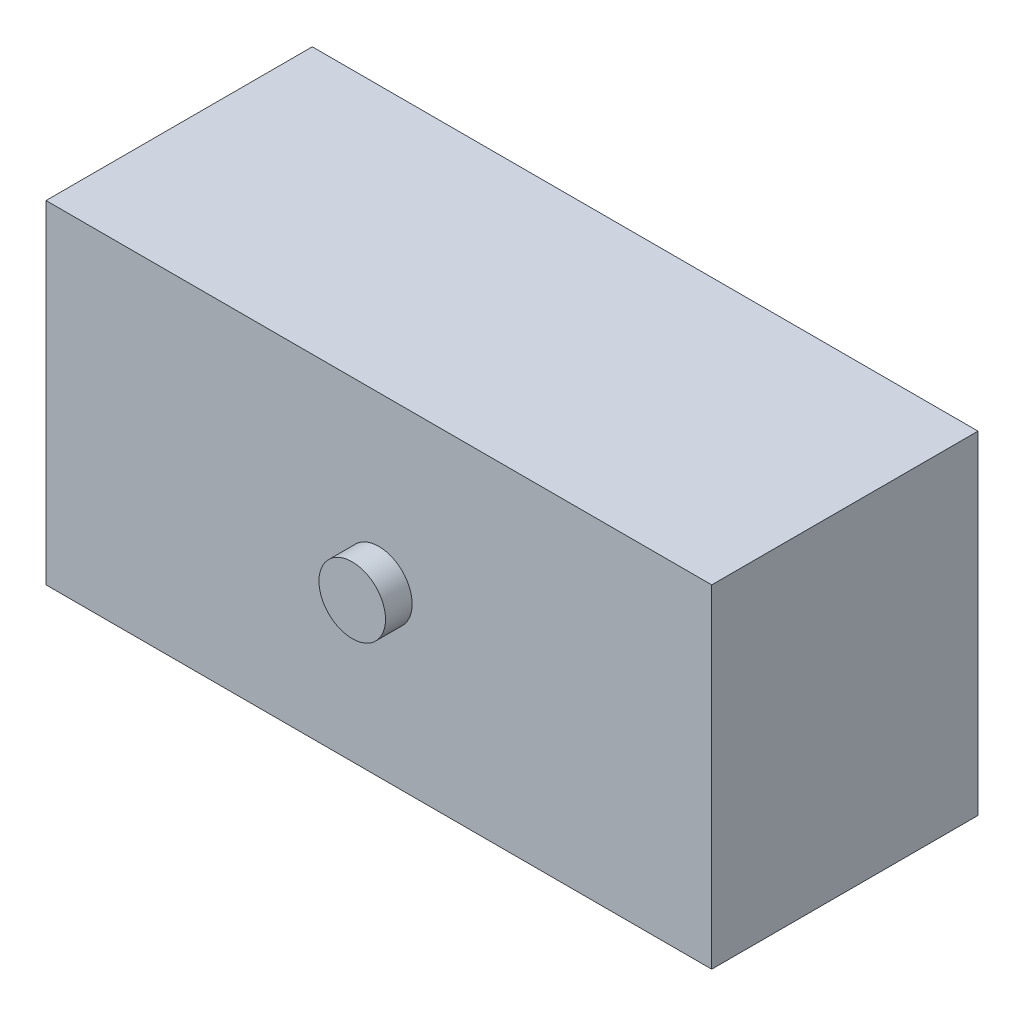
ISO-10303-21;
HEADER;
FILE_DESCRIPTION(('STEP AP214'),'2;1');
FILE_NAME('part.step','',(''),(''),'','','');
FILE_SCHEMA(('AUTOMOTIVE_DESIGN { 1 0 10303 214 1 1 1 1 }'));
ENDSEC;
DATA;
#1=APPLICATION_CONTEXT('core data for automotive mechanical design processes');
#2=APPLICATION_PROTOCOL_DEFINITION('international standard','automotive_design',2000,#1);
#3=PRODUCT_CONTEXT('',#1,'mechanical');
#4=PRODUCT('Part','Part','',(#3));
#5=PRODUCT_RELATED_PRODUCT_CATEGORY('part','',(#4));
#6=PRODUCT_DEFINITION_FORMATION('','',#4);
#7=PRODUCT_DEFINITION_CONTEXT('part definition',#1,'design');
#8=PRODUCT_DEFINITION('design','',#6,#7);
#9=PRODUCT_DEFINITION_SHAPE('','',#8);
#10=(LENGTH_UNIT() NAMED_UNIT(*) SI_UNIT(.MILLI.,.METRE.));
#11=(NAMED_UNIT(*) PLANE_ANGLE_UNIT() SI_UNIT($,.RADIAN.));
#12=(NAMED_UNIT(*) SI_UNIT($,.STERADIAN.) SOLID_ANGLE_UNIT());
#13=UNCERTAINTY_MEASURE_WITH_UNIT(LENGTH_MEASURE(1.E-05),#10,'distance_accuracy_value','');
#14=(GEOMETRIC_REPRESENTATION_CONTEXT(3) GLOBAL_UNCERTAINTY_ASSIGNED_CONTEXT((#13)) GLOBAL_UNIT_ASSIGNED_CONTEXT((#10,
#11,#12)) REPRESENTATION_CONTEXT('',''));
#15=CARTESIAN_POINT('',(0.,0.,0.));
#16=DIRECTION('',(0.,0.,1.));
#17=DIRECTION('',(1.,0.,0.));
#18=AXIS2_PLACEMENT_3D('',#15,#16,#17);
#19=CARTESIAN_POINT('',(25.,-12.5,-20.));
#20=DIRECTION('',(1.,0.,0.));
#21=DIRECTION('',(0.,0.,-1.));
#22=AXIS2_PLACEMENT_3D('',#19,#20,#21);
#23=PLANE('',#22);
#24=DIRECTION('',(0.,1.,0.));
#25=VECTOR('',#24,1.);
#26=CARTESIAN_POINT('',(25.,-12.5,0.));
#27=LINE('',#26,#25);
#28=CARTESIAN_POINT('',(25.,-12.5,0.));
#29=VERTEX_POINT('',#28);
#30=CARTESIAN_POINT('',(25.,12.5,0.));
#31=VERTEX_POINT('',#30);
#32=EDGE_CURVE('E93',#29,#31,#27,.T.);
#33=ORIENTED_EDGE('',*,*,#32,.F.);
#34=DIRECTION('',(0.,0.,1.));
#35=VECTOR('',#34,1.);
#36=CARTESIAN_POINT('',(25.,-12.5,-20.));
#37=LINE('',#36,#35);
#38=CARTESIAN_POINT('',(25.,-12.5,-20.));
#39=VERTEX_POINT('',#38);
#40=EDGE_CURVE('E28',#39,#29,#37,.T.);
#41=ORIENTED_EDGE('',*,*,#40,.F.);
#42=DIRECTION('',(0.,1.,0.));
#43=VECTOR('',#42,1.);
#44=CARTESIAN_POINT('',(25.,-12.5,-20.));
#45=LINE('',#44,#43);
#46=CARTESIAN_POINT('',(25.,12.5,-20.));
#47=VERTEX_POINT('',#46);
#48=EDGE_CURVE('E83',#39,#47,#45,.T.);
#49=ORIENTED_EDGE('',*,*,#48,.T.);
#50=DIRECTION('',(0.,0.,1.));
#51=VECTOR('',#50,1.);
#52=CARTESIAN_POINT('',(25.,12.5,-20.));
#53=LINE('',#52,#51);
#54=EDGE_CURVE('E63',#47,#31,#53,.T.);
#55=ORIENTED_EDGE('',*,*,#54,.T.);
#56=EDGE_LOOP('',(#33,#41,#49,#55));
#57=FACE_BOUND('',#56,.T.);
#58=ADVANCED_FACE('F19',(#57),#23,.T.);
#59=CARTESIAN_POINT('',(-25.,-12.5,-20.));
#60=DIRECTION('',(0.,-1.,0.));
#61=DIRECTION('',(0.,0.,-1.));
#62=AXIS2_PLACEMENT_3D('',#59,#60,#61);
#63=PLANE('',#62);
#64=DIRECTION('',(1.,0.,0.));
#65=VECTOR('',#64,1.);
#66=CARTESIAN_POINT('',(-25.,-12.5,0.));
#67=LINE('',#66,#65);
#68=CARTESIAN_POINT('',(-25.,-12.5,0.));
#69=VERTEX_POINT('',#68);
#70=EDGE_CURVE('E87',#69,#29,#67,.T.);
#71=ORIENTED_EDGE('',*,*,#70,.F.);
#72=DIRECTION('',(0.,0.,1.));
#73=VECTOR('',#72,1.);
#74=CARTESIAN_POINT('',(-25.,-12.5,-20.));
#75=LINE('',#74,#73);
#76=CARTESIAN_POINT('',(-25.,-12.5,-20.));
#77=VERTEX_POINT('',#76);
#78=EDGE_CURVE('E52',#77,#69,#75,.T.);
#79=ORIENTED_EDGE('',*,*,#78,.F.);
#80=DIRECTION('',(1.,0.,0.));
#81=VECTOR('',#80,1.);
#82=CARTESIAN_POINT('',(-25.,-12.5,-20.));
#83=LINE('',#82,#81);
#84=EDGE_CURVE('E78',#77,#39,#83,.T.);
#85=ORIENTED_EDGE('',*,*,#84,.T.);
#86=ORIENTED_EDGE('',*,*,#40,.T.);
#87=EDGE_LOOP('',(#71,#79,#85,#86));
#88=FACE_BOUND('',#87,.T.);
#89=ADVANCED_FACE('F119',(#88),#63,.T.);
#90=CARTESIAN_POINT('',(-25.,-12.5,-20.));
#91=DIRECTION('',(-1.,0.,0.));
#92=DIRECTION('',(0.,0.,1.));
#93=AXIS2_PLACEMENT_3D('',#90,#91,#92);
#94=PLANE('',#93);
#95=DIRECTION('',(0.,-1.,0.));
#96=VECTOR('',#95,1.);
#97=CARTESIAN_POINT('',(-25.,-12.5,0.));
#98=LINE('',#97,#96);
#99=CARTESIAN_POINT('',(-25.,12.5,0.));
#100=VERTEX_POINT('',#99);
#101=EDGE_CURVE('E71',#100,#69,#98,.T.);
#102=ORIENTED_EDGE('',*,*,#101,.F.);
#103=DIRECTION('',(0.,0.,1.));
#104=VECTOR('',#103,1.);
#105=CARTESIAN_POINT('',(-25.,12.5,-20.));
#106=LINE('',#105,#104);
#107=CARTESIAN_POINT('',(-25.,12.5,-20.));
#108=VERTEX_POINT('',#107);
#109=EDGE_CURVE('E66',#108,#100,#106,.T.);
#110=ORIENTED_EDGE('',*,*,#109,.F.);
#111=DIRECTION('',(0.,-1.,0.));
#112=VECTOR('',#111,1.);
#113=CARTESIAN_POINT('',(-25.,-12.5,-20.));
#114=LINE('',#113,#112);
#115=EDGE_CURVE('E69',#108,#77,#114,.T.);
#116=ORIENTED_EDGE('',*,*,#115,.T.);
#117=ORIENTED_EDGE('',*,*,#78,.T.);
#118=EDGE_LOOP('',(#102,#110,#116,#117));
#119=FACE_BOUND('',#118,.T.);
#120=ADVANCED_FACE('F68',(#119),#94,.T.);
#121=CARTESIAN_POINT('',(-25.,12.5,-20.));
#122=DIRECTION('',(0.,1.,0.));
#123=DIRECTION('',(0.,0.,1.));
#124=AXIS2_PLACEMENT_3D('',#121,#122,#123);
#125=PLANE('',#124);
#126=DIRECTION('',(-1.,0.,0.));
#127=VECTOR('',#126,1.);
#128=CARTESIAN_POINT('',(-25.,12.5,0.));
#129=LINE('',#128,#127);
#130=EDGE_CURVE('E98',#31,#100,#129,.T.);
#131=ORIENTED_EDGE('',*,*,#130,.F.);
#132=ORIENTED_EDGE('',*,*,#54,.F.);
#133=DIRECTION('',(-1.,0.,0.));
#134=VECTOR('',#133,1.);
#135=CARTESIAN_POINT('',(-25.,12.5,-20.));
#136=LINE('',#135,#134);
#137=EDGE_CURVE('E77',#47,#108,#136,.T.);
#138=ORIENTED_EDGE('',*,*,#137,.T.);
#139=ORIENTED_EDGE('',*,*,#109,.T.);
#140=EDGE_LOOP('',(#131,#132,#138,#139));
#141=FACE_BOUND('',#140,.T.);
#142=ADVANCED_FACE('F81',(#141),#125,.T.);
#143=CARTESIAN_POINT('',(0.,0.,-20.));
#144=DIRECTION('',(0.,0.,-1.));
#145=DIRECTION('',(-1.,0.,0.));
#146=AXIS2_PLACEMENT_3D('',#143,#144,#145);
#147=PLANE('',#146);
#148=ORIENTED_EDGE('',*,*,#48,.F.);
#149=ORIENTED_EDGE('',*,*,#84,.F.);
#150=ORIENTED_EDGE('',*,*,#115,.F.);
#151=ORIENTED_EDGE('',*,*,#137,.F.);
#152=EDGE_LOOP('',(#148,#149,#150,#151));
#153=FACE_BOUND('',#152,.T.);
#154=ADVANCED_FACE('F76',(#153),#147,.T.);
#155=CARTESIAN_POINT('',(0.,0.,0.));
#156=DIRECTION('',(0.,0.,-1.));
#157=DIRECTION('',(-1.,0.,0.));
#158=AXIS2_PLACEMENT_3D('',#155,#156,#157);
#159=PLANE('',#158);
#160=CARTESIAN_POINT('',(0.,0.,0.));
#161=DIRECTION('',(0.,0.,-1.));
#162=DIRECTION('',(-1.,0.,0.));
#163=AXIS2_PLACEMENT_3D('',#160,#161,#162);
#164=CIRCLE('',#163,2.5);
#165=CARTESIAN_POINT('',(-2.5,0.,0.));
#166=VERTEX_POINT('',#165);
#167=EDGE_CURVE('E11',#166,#166,#164,.F.);
#168=ORIENTED_EDGE('',*,*,#167,.F.);
#169=EDGE_LOOP('',(#168));
#170=FACE_BOUND('',#169,.T.);
#171=ORIENTED_EDGE('',*,*,#32,.T.);
#172=ORIENTED_EDGE('',*,*,#130,.T.);
#173=ORIENTED_EDGE('',*,*,#101,.T.);
#174=ORIENTED_EDGE('',*,*,#70,.T.);
#175=EDGE_LOOP('',(#171,#172,#173,#174));
#176=FACE_BOUND('',#175,.T.);
#177=ADVANCED_FACE('F118',(#170,#176),#159,.F.);
#178=CARTESIAN_POINT('',(0.,0.,2.));
#179=DIRECTION('',(0.,0.,-1.));
#180=DIRECTION('',(-1.,0.,0.));
#181=AXIS2_PLACEMENT_3D('',#178,#179,#180);
#182=CYLINDRICAL_SURFACE('',#181,2.5);
#183=CARTESIAN_POINT('',(0.,0.,2.));
#184=DIRECTION('',(0.,0.,1.));
#185=DIRECTION('',(1.,0.,0.));
#186=AXIS2_PLACEMENT_3D('',#183,#184,#185);
#187=CIRCLE('',#186,2.5);
#188=CARTESIAN_POINT('',(2.5,0.,2.));
#189=VERTEX_POINT('',#188);
#190=EDGE_CURVE('E99',#189,#189,#187,.T.);
#191=ORIENTED_EDGE('',*,*,#190,.F.);
#192=EDGE_LOOP('',(#191));
#193=FACE_BOUND('',#192,.T.);
#194=ORIENTED_EDGE('',*,*,#167,.T.);
#195=EDGE_LOOP('',(#194));
#196=FACE_BOUND('',#195,.T.);
#197=ADVANCED_FACE('F134',(#193,#196),#182,.T.);
#198=CARTESIAN_POINT('',(0.,0.,2.));
#199=DIRECTION('',(0.,0.,1.));
#200=DIRECTION('',(1.,0.,0.));
#201=AXIS2_PLACEMENT_3D('',#198,#199,#200);
#202=PLANE('',#201);
#203=ORIENTED_EDGE('',*,*,#190,.T.);
#204=EDGE_LOOP('',(#203));
#205=FACE_BOUND('',#204,.T.);
#206=ADVANCED_FACE('F139',(#205),#202,.T.);
#207=CLOSED_SHELL('',(#58,#89,#120,#142,#154,#177,#197,#206));
#208=MANIFOLD_SOLID_BREP('B1',#207);
#209=ADVANCED_BREP_SHAPE_REPRESENTATION('',(#18,#208),#14);
#210=SHAPE_DEFINITION_REPRESENTATION(#9,#209);
ENDSEC;
END-ISO-10303-21;
